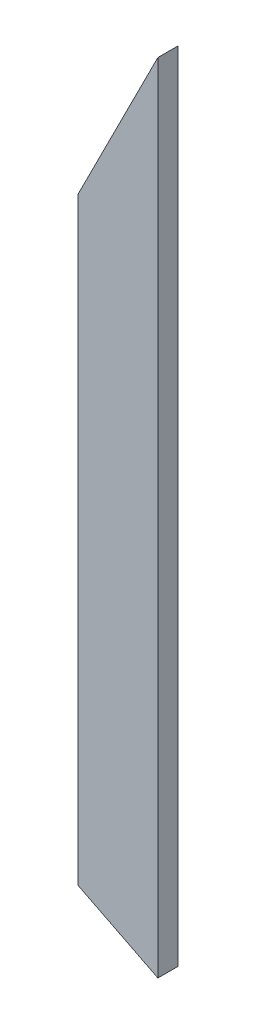
ISO-10303-21;
HEADER;
FILE_DESCRIPTION(('STEP AP214'),'2;1');
FILE_NAME('part.step','',(''),(''),'','','');
FILE_SCHEMA(('AUTOMOTIVE_DESIGN { 1 0 10303 214 1 1 1 1 }'));
ENDSEC;
DATA;
#1=APPLICATION_CONTEXT('core data for automotive mechanical design processes');
#2=APPLICATION_PROTOCOL_DEFINITION('international standard','automotive_design',2000,#1);
#3=PRODUCT_CONTEXT('',#1,'mechanical');
#4=PRODUCT('Part','Part','',(#3));
#5=PRODUCT_RELATED_PRODUCT_CATEGORY('part','',(#4));
#6=PRODUCT_DEFINITION_FORMATION('','',#4);
#7=PRODUCT_DEFINITION_CONTEXT('part definition',#1,'design');
#8=PRODUCT_DEFINITION('design','',#6,#7);
#9=PRODUCT_DEFINITION_SHAPE('','',#8);
#10=(LENGTH_UNIT() NAMED_UNIT(*) SI_UNIT(.MILLI.,.METRE.));
#11=(NAMED_UNIT(*) PLANE_ANGLE_UNIT() SI_UNIT($,.RADIAN.));
#12=(NAMED_UNIT(*) SI_UNIT($,.STERADIAN.) SOLID_ANGLE_UNIT());
#13=UNCERTAINTY_MEASURE_WITH_UNIT(LENGTH_MEASURE(1.E-05),#10,'distance_accuracy_value','');
#14=(GEOMETRIC_REPRESENTATION_CONTEXT(3) GLOBAL_UNCERTAINTY_ASSIGNED_CONTEXT((#13)) GLOBAL_UNIT_ASSIGNED_CONTEXT((#10,
#11,#12)) REPRESENTATION_CONTEXT('',''));
#15=CARTESIAN_POINT('',(0.,0.,0.));
#16=DIRECTION('',(0.,0.,1.));
#17=DIRECTION('',(1.,0.,0.));
#18=AXIS2_PLACEMENT_3D('',#15,#16,#17);
#19=CARTESIAN_POINT('',(-96.9794047857556,-192.274176868363,12.7));
#20=DIRECTION('',(-0.450340007604232,-0.892857142857143,0.));
#21=DIRECTION('',(0.892857142857143,-0.450340007604232,0.));
#22=AXIS2_PLACEMENT_3D('',#19,#20,#21);
#23=PLANE('',#22);
#24=DIRECTION('',(-0.892857142857143,0.450340007604232,0.));
#25=VECTOR('',#24,1.);
#26=CARTESIAN_POINT('',(-96.9794047857556,-192.274176868363,0.));
#27=LINE('',#26,#25);
#28=CARTESIAN_POINT('',(25.4,-254.,0.));
#29=VERTEX_POINT('',#28);
#30=CARTESIAN_POINT('',(-25.4,-228.37745492735,0.));
#31=VERTEX_POINT('',#30);
#32=EDGE_CURVE('E110',#29,#31,#27,.T.);
#33=ORIENTED_EDGE('',*,*,#32,.F.);
#34=DIRECTION('',(0.,0.,-1.));
#35=VECTOR('',#34,1.);
#36=CARTESIAN_POINT('',(25.4,-254.,12.7));
#37=LINE('',#36,#35);
#38=CARTESIAN_POINT('',(25.4,-254.,12.7));
#39=VERTEX_POINT('',#38);
#40=EDGE_CURVE('E11',#39,#29,#37,.T.);
#41=ORIENTED_EDGE('',*,*,#40,.F.);
#42=DIRECTION('',(-0.892857142857143,0.450340007604232,0.));
#43=VECTOR('',#42,1.);
#44=CARTESIAN_POINT('',(-96.9794047857556,-192.274176868363,12.7));
#45=LINE('',#44,#43);
#46=CARTESIAN_POINT('',(-25.4,-228.37745492735,12.7));
#47=VERTEX_POINT('',#46);
#48=EDGE_CURVE('E101',#39,#47,#45,.T.);
#49=ORIENTED_EDGE('',*,*,#48,.T.);
#50=DIRECTION('',(0.,0.,-1.));
#51=VECTOR('',#50,1.);
#52=CARTESIAN_POINT('',(-25.4,-228.37745492735,12.7));
#53=LINE('',#52,#51);
#54=EDGE_CURVE('E80',#47,#31,#53,.T.);
#55=ORIENTED_EDGE('',*,*,#54,.T.);
#56=EDGE_LOOP('',(#33,#41,#49,#55));
#57=FACE_BOUND('',#56,.T.);
#58=ADVANCED_FACE('F41',(#57),#23,.T.);
#59=CARTESIAN_POINT('',(25.4,0.,12.7));
#60=DIRECTION('',(1.,0.,0.));
#61=DIRECTION('',(0.,1.,0.));
#62=AXIS2_PLACEMENT_3D('',#59,#60,#61);
#63=PLANE('',#62);
#64=DIRECTION('',(0.,-1.,0.));
#65=VECTOR('',#64,1.);
#66=CARTESIAN_POINT('',(25.4,0.,0.));
#67=LINE('',#66,#65);
#68=CARTESIAN_POINT('',(25.3999999999999,254.,0.));
#69=VERTEX_POINT('',#68);
#70=EDGE_CURVE('E93',#69,#29,#67,.T.);
#71=ORIENTED_EDGE('',*,*,#70,.F.);
#72=DIRECTION('',(0.,0.,-1.));
#73=VECTOR('',#72,1.);
#74=CARTESIAN_POINT('',(25.3999999999999,254.,12.7));
#75=LINE('',#74,#73);
#76=CARTESIAN_POINT('',(25.3999999999999,254.,12.7));
#77=VERTEX_POINT('',#76);
#78=EDGE_CURVE('E50',#77,#69,#75,.T.);
#79=ORIENTED_EDGE('',*,*,#78,.F.);
#80=DIRECTION('',(0.,-1.,0.));
#81=VECTOR('',#80,1.);
#82=CARTESIAN_POINT('',(25.4,0.,12.7));
#83=LINE('',#82,#81);
#84=EDGE_CURVE('E91',#77,#39,#83,.T.);
#85=ORIENTED_EDGE('',*,*,#84,.T.);
#86=ORIENTED_EDGE('',*,*,#40,.T.);
#87=EDGE_LOOP('',(#71,#79,#85,#86));
#88=FACE_BOUND('',#87,.T.);
#89=ADVANCED_FACE('F89',(#88),#63,.T.);
#90=CARTESIAN_POINT('',(-81.9031551426229,41.3230892418452,12.7));
#91=DIRECTION('',(0.892801429036147,-0.45045045045045,0.));
#92=DIRECTION('',(0.45045045045045,0.892801429036147,0.));
#93=AXIS2_PLACEMENT_3D('',#90,#91,#92);
#94=PLANE('',#93);
#95=DIRECTION('',(-0.45045045045045,-0.892801429036147,0.));
#96=VECTOR('',#95,1.);
#97=CARTESIAN_POINT('',(-81.9031551426229,41.3230892418452,0.));
#98=LINE('',#97,#96);
#99=CARTESIAN_POINT('',(-25.4,153.31342603902,0.));
#100=VERTEX_POINT('',#99);
#101=EDGE_CURVE('E73',#69,#100,#98,.T.);
#102=ORIENTED_EDGE('',*,*,#101,.T.);
#103=DIRECTION('',(0.,0.,-1.));
#104=VECTOR('',#103,1.);
#105=CARTESIAN_POINT('',(-25.4,153.31342603902,12.7));
#106=LINE('',#105,#104);
#107=CARTESIAN_POINT('',(-25.4,153.31342603902,12.7));
#108=VERTEX_POINT('',#107);
#109=EDGE_CURVE('E95',#108,#100,#106,.T.);
#110=ORIENTED_EDGE('',*,*,#109,.F.);
#111=DIRECTION('',(-0.45045045045045,-0.892801429036147,0.));
#112=VECTOR('',#111,1.);
#113=CARTESIAN_POINT('',(-81.9031551426229,41.3230892418452,12.7));
#114=LINE('',#113,#112);
#115=EDGE_CURVE('E96',#77,#108,#114,.T.);
#116=ORIENTED_EDGE('',*,*,#115,.F.);
#117=ORIENTED_EDGE('',*,*,#78,.T.);
#118=EDGE_LOOP('',(#102,#110,#116,#117));
#119=FACE_BOUND('',#118,.T.);
#120=ADVANCED_FACE('F97',(#119),#94,.F.);
#121=CARTESIAN_POINT('',(-25.4,0.,12.7));
#122=DIRECTION('',(1.,0.,0.));
#123=DIRECTION('',(0.,1.,0.));
#124=AXIS2_PLACEMENT_3D('',#121,#122,#123);
#125=PLANE('',#124);
#126=DIRECTION('',(0.,-1.,0.));
#127=VECTOR('',#126,1.);
#128=CARTESIAN_POINT('',(-25.4,0.,0.));
#129=LINE('',#128,#127);
#130=EDGE_CURVE('E105',#100,#31,#129,.T.);
#131=ORIENTED_EDGE('',*,*,#130,.T.);
#132=ORIENTED_EDGE('',*,*,#54,.F.);
#133=DIRECTION('',(0.,-1.,0.));
#134=VECTOR('',#133,1.);
#135=CARTESIAN_POINT('',(-25.4,0.,12.7));
#136=LINE('',#135,#134);
#137=EDGE_CURVE('E58',#108,#47,#136,.T.);
#138=ORIENTED_EDGE('',*,*,#137,.F.);
#139=ORIENTED_EDGE('',*,*,#109,.T.);
#140=EDGE_LOOP('',(#131,#132,#138,#139));
#141=FACE_BOUND('',#140,.T.);
#142=ADVANCED_FACE('F125',(#141),#125,.F.);
#143=CARTESIAN_POINT('',(0.,0.,12.7));
#144=DIRECTION('',(0.,0.,1.));
#145=DIRECTION('',(1.,0.,0.));
#146=AXIS2_PLACEMENT_3D('',#143,#144,#145);
#147=PLANE('',#146);
#148=ORIENTED_EDGE('',*,*,#48,.F.);
#149=ORIENTED_EDGE('',*,*,#84,.F.);
#150=ORIENTED_EDGE('',*,*,#115,.T.);
#151=ORIENTED_EDGE('',*,*,#137,.T.);
#152=EDGE_LOOP('',(#148,#149,#150,#151));
#153=FACE_BOUND('',#152,.T.);
#154=ADVANCED_FACE('F100',(#153),#147,.T.);
#155=CARTESIAN_POINT('',(0.,0.,0.));
#156=DIRECTION('',(0.,0.,1.));
#157=DIRECTION('',(1.,0.,0.));
#158=AXIS2_PLACEMENT_3D('',#155,#156,#157);
#159=PLANE('',#158);
#160=ORIENTED_EDGE('',*,*,#32,.T.);
#161=ORIENTED_EDGE('',*,*,#130,.F.);
#162=ORIENTED_EDGE('',*,*,#101,.F.);
#163=ORIENTED_EDGE('',*,*,#70,.T.);
#164=EDGE_LOOP('',(#160,#161,#162,#163));
#165=FACE_BOUND('',#164,.T.);
#166=ADVANCED_FACE('F127',(#165),#159,.F.);
#167=CLOSED_SHELL('',(#58,#89,#120,#142,#154,#166));
#168=MANIFOLD_SOLID_BREP('B2',#167);
#169=ADVANCED_BREP_SHAPE_REPRESENTATION('',(#18,#168),#14);
#170=SHAPE_DEFINITION_REPRESENTATION(#9,#169);
ENDSEC;
END-ISO-10303-21;
